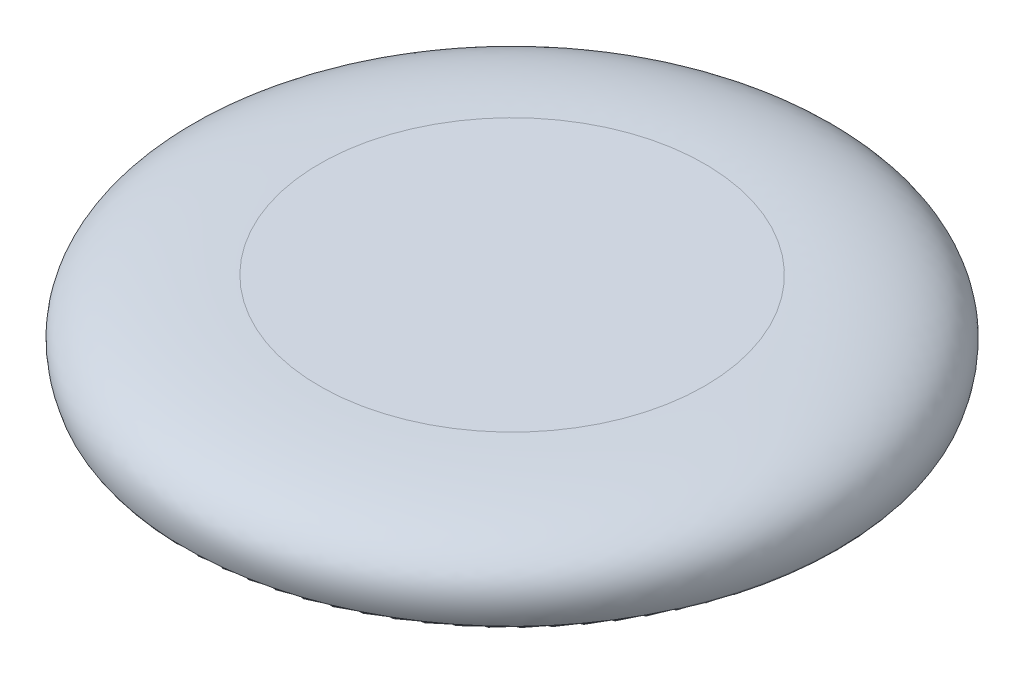
ISO-10303-21;
HEADER;
FILE_DESCRIPTION(('STEP AP214'),'2;1');
FILE_NAME('part.step','',(''),(''),'','','');
FILE_SCHEMA(('AUTOMOTIVE_DESIGN { 1 0 10303 214 1 1 1 1 }'));
ENDSEC;
DATA;
#1=APPLICATION_CONTEXT('core data for automotive mechanical design processes');
#2=APPLICATION_PROTOCOL_DEFINITION('international standard','automotive_design',2000,#1);
#3=PRODUCT_CONTEXT('',#1,'mechanical');
#4=PRODUCT('Part','Part','',(#3));
#5=PRODUCT_RELATED_PRODUCT_CATEGORY('part','',(#4));
#6=PRODUCT_DEFINITION_FORMATION('','',#4);
#7=PRODUCT_DEFINITION_CONTEXT('part definition',#1,'design');
#8=PRODUCT_DEFINITION('design','',#6,#7);
#9=PRODUCT_DEFINITION_SHAPE('','',#8);
#10=(LENGTH_UNIT() NAMED_UNIT(*) SI_UNIT(.MILLI.,.METRE.));
#11=(NAMED_UNIT(*) PLANE_ANGLE_UNIT() SI_UNIT($,.RADIAN.));
#12=(NAMED_UNIT(*) SI_UNIT($,.STERADIAN.) SOLID_ANGLE_UNIT());
#13=UNCERTAINTY_MEASURE_WITH_UNIT(LENGTH_MEASURE(1.E-05),#10,'distance_accuracy_value','');
#14=(GEOMETRIC_REPRESENTATION_CONTEXT(3) GLOBAL_UNCERTAINTY_ASSIGNED_CONTEXT((#13)) GLOBAL_UNIT_ASSIGNED_CONTEXT((#10,
#11,#12)) REPRESENTATION_CONTEXT('',''));
#15=CARTESIAN_POINT('',(0.,0.,0.));
#16=DIRECTION('',(0.,0.,1.));
#17=DIRECTION('',(1.,0.,0.));
#18=AXIS2_PLACEMENT_3D('',#15,#16,#17);
#19=CARTESIAN_POINT('',(0.,29.,0.));
#20=DIRECTION('',(0.,-1.,0.));
#21=DIRECTION('',(1.,0.,0.));
#22=AXIS2_PLACEMENT_3D('',#19,#20,#21);
#23=PLANE('',#22);
#24=CARTESIAN_POINT('',(0.,29.,0.));
#25=DIRECTION('',(0.,-1.,0.));
#26=DIRECTION('',(1.,0.,0.));
#27=AXIS2_PLACEMENT_3D('',#24,#25,#26);
#28=CIRCLE('',#27,80.);
#29=CARTESIAN_POINT('',(80.,29.,0.));
#30=VERTEX_POINT('',#29);
#31=EDGE_CURVE('E61',#30,#30,#28,.T.);
#32=ORIENTED_EDGE('',*,*,#31,.T.);
#33=EDGE_LOOP('',(#32));
#34=FACE_BOUND('',#33,.T.);
#35=ADVANCED_FACE('F41',(#34),#23,.T.);
#36=CARTESIAN_POINT('',(80.,29.,0.));
#37=CARTESIAN_POINT('',(80.689072442312,29.,0.));
#38=CARTESIAN_POINT('',(82.0768627169495,28.9948464655879,0.));
#39=CARTESIAN_POINT('',(84.775164613557,28.963951160128,0.));
#40=CARTESIAN_POINT('',(88.0563541162947,28.8867817295365,0.));
#41=CARTESIAN_POINT('',(91.8299515075125,28.7326969637539,0.));
#42=CARTESIAN_POINT('',(96.6482998290496,28.4456187662775,0.));
#43=CARTESIAN_POINT('',(102.267656423896,27.9344373639931,0.));
#44=CARTESIAN_POINT('',(108.361107153441,27.0808073894777,0.));
#45=CARTESIAN_POINT('',(113.798438754182,25.9923180921626,0.));
#46=CARTESIAN_POINT('',(120.163760178967,24.2404422517693,0.));
#47=CARTESIAN_POINT('',(126.444056898713,21.515342649294,0.));
#48=CARTESIAN_POINT('',(129.940253056564,18.6715989143196,0.));
#49=CARTESIAN_POINT('',(131.564316018938,16.6883060670833,0.));
#50=CARTESIAN_POINT('',(132.538964768356,15.2595978349276,0.));
#51=CARTESIAN_POINT('',(133.44086849453,13.2651534482053,0.));
#52=CARTESIAN_POINT('',(133.972265686486,10.640097783018,0.));
#53=CARTESIAN_POINT('',(133.976836941374,8.29410615751145,0.));
#54=CARTESIAN_POINT('',(133.7079010204,6.24297680164635,0.));
#55=CARTESIAN_POINT('',(133.364260873871,4.61759347200709,0.));
#56=CARTESIAN_POINT('',(132.954452213561,3.18817437948394,0.));
#57=CARTESIAN_POINT('',(132.553131280972,2.00704244183232,0.));
#58=CARTESIAN_POINT('',(132.323417751652,1.3930934696551,0.));
#59=CARTESIAN_POINT('',(132.205627951561,1.09155158142143,0.));
#60=B_SPLINE_CURVE_WITH_KNOTS('',3,(#36,#37,#38,#39,#40,#41,#42,#43,#44,#45,#46,#47,#48,#49,#50,
#51,#52,#53,#54,#55,#56,#57,#58,#59),.UNSPECIFIED.,.F.,.F.,(4,1,1,1,1,1,1,1,1,1,1,1,1,1,1,1,1,1,
1,1,1,4),(0.,0.015625,0.03125,0.0625,0.09375,0.125,0.1875,0.25,0.3125,0.375,0.5,0.625,
0.647010898071307,0.678260898071307,0.75,0.8125,0.875,0.90625,0.9375,0.96875,0.984375,1.),.UNSPECIFIED.);
#61=CARTESIAN_POINT('',(0.,0.,0.));
#62=DIRECTION('',(0.,-1.,0.));
#63=AXIS1_PLACEMENT('',#61,#62);
#64=SURFACE_OF_REVOLUTION('',#60,#63);
#65=CARTESIAN_POINT('',(0.,16.2567064395825,0.));
#66=DIRECTION('',(0.,-1.,0.));
#67=DIRECTION('',(1.,0.,0.));
#68=AXIS2_PLACEMENT_3D('',#65,#66,#67);
#69=CIRCLE('',#68,131.851977882948);
#70=CARTESIAN_POINT('',(131.851977882948,16.2567064395825,0.));
#71=VERTEX_POINT('',#70);
#72=EDGE_CURVE('E64',#71,#71,#69,.T.);
#73=ORIENTED_EDGE('',*,*,#72,.T.);
#74=EDGE_LOOP('',(#73));
#75=FACE_BOUND('',#74,.T.);
#76=ORIENTED_EDGE('',*,*,#31,.F.);
#77=EDGE_LOOP('',(#76));
#78=FACE_BOUND('',#77,.T.);
#79=ADVANCED_FACE('F92',(#75,#78),#64,.F.);
#80=CARTESIAN_POINT('',(0.,16.2567064395825,0.));
#81=DIRECTION('',(0.,1.,0.));
#82=DIRECTION('',(-1.,0.,0.));
#83=AXIS2_PLACEMENT_3D('',#80,#81,#82);
#84=CONICAL_SURFACE('',#83,131.851977882948,0.0523598775594309);
#85=CARTESIAN_POINT('',(0.,2.10467191248531,0.));
#86=DIRECTION('',(0.,-1.,0.));
#87=DIRECTION('',(1.,0.,0.));
#88=AXIS2_PLACEMENT_3D('',#85,#86,#87);
#89=CIRCLE('',#88,131.110301181052);
#90=CARTESIAN_POINT('',(131.110301181052,2.10467191248531,0.));
#91=VERTEX_POINT('',#90);
#92=EDGE_CURVE('E56',#91,#91,#89,.T.);
#93=ORIENTED_EDGE('',*,*,#92,.T.);
#94=EDGE_LOOP('',(#93));
#95=FACE_BOUND('',#94,.T.);
#96=ORIENTED_EDGE('',*,*,#72,.F.);
#97=EDGE_LOOP('',(#96));
#98=FACE_BOUND('',#97,.T.);
#99=ADVANCED_FACE('F89',(#95,#98),#84,.F.);
#100=CARTESIAN_POINT('',(131.,0.,0.));
#101=DIRECTION('',(0.,-1.,0.));
#102=DIRECTION('',(1.,0.,0.));
#103=AXIS2_PLACEMENT_3D('',#100,#101,#102);
#104=PLANE('',#103);
#105=CARTESIAN_POINT('',(0.,0.,0.));
#106=DIRECTION('',(0.,-1.,0.));
#107=DIRECTION('',(1.,0.,0.));
#108=AXIS2_PLACEMENT_3D('',#105,#106,#107);
#109=CIRCLE('',#108,133.107560250561);
#110=CARTESIAN_POINT('',(133.107560250561,0.,0.));
#111=VERTEX_POINT('',#110);
#112=EDGE_CURVE('E48',#111,#111,#109,.F.);
#113=ORIENTED_EDGE('',*,*,#112,.T.);
#114=EDGE_LOOP('',(#113));
#115=FACE_BOUND('',#114,.T.);
#116=CARTESIAN_POINT('',(0.,0.,0.));
#117=DIRECTION('',(0.,-1.,0.));
#118=DIRECTION('',(1.,0.,0.));
#119=AXIS2_PLACEMENT_3D('',#116,#117,#118);
#120=CIRCLE('',#119,133.605230175748);
#121=CARTESIAN_POINT('',(133.605230175748,0.,0.));
#122=VERTEX_POINT('',#121);
#123=EDGE_CURVE('E52',#122,#122,#120,.T.);
#124=ORIENTED_EDGE('',*,*,#123,.T.);
#125=EDGE_LOOP('',(#124));
#126=FACE_BOUND('',#125,.T.);
#127=ADVANCED_FACE('F86',(#115,#126),#104,.T.);
#128=CARTESIAN_POINT('',(135.,0.,0.));
#129=CARTESIAN_POINT('',(147.5,32.,0.));
#130=CARTESIAN_POINT('',(80.,32.,0.));
#131=(BOUNDED_CURVE() B_SPLINE_CURVE(2,(#128,#129,#130),.UNSPECIFIED.,.F.,
.F.) B_SPLINE_CURVE_WITH_KNOTS((3,3),(0.,1.),
.UNSPECIFIED.) CURVE() GEOMETRIC_REPRESENTATION_ITEM() RATIONAL_B_SPLINE_CURVE((1.,1.,1.)) REPRESENTATION_ITEM(''));
#132=CARTESIAN_POINT('',(0.,0.,0.));
#133=DIRECTION('',(0.,-1.,0.));
#134=AXIS1_PLACEMENT('',#132,#133);
#135=SURFACE_OF_REVOLUTION('',#131,#134);
#136=CARTESIAN_POINT('',(0.,1.34817455261361,0.));
#137=DIRECTION('',(0.,-1.,0.));
#138=DIRECTION('',(1.,0.,0.));
#139=AXIS2_PLACEMENT_3D('',#136,#137,#138);
#140=CIRCLE('',#139,135.496029897067);
#141=CARTESIAN_POINT('',(135.496029897067,1.34817455261361,0.));
#142=VERTEX_POINT('',#141);
#143=EDGE_CURVE('E10',#142,#142,#140,.F.);
#144=ORIENTED_EDGE('',*,*,#143,.T.);
#145=EDGE_LOOP('',(#144));
#146=FACE_BOUND('',#145,.T.);
#147=CARTESIAN_POINT('',(0.,32.,0.));
#148=DIRECTION('',(0.,-1.,0.));
#149=DIRECTION('',(1.,0.,0.));
#150=AXIS2_PLACEMENT_3D('',#147,#148,#149);
#151=CIRCLE('',#150,80.);
#152=CARTESIAN_POINT('',(80.,32.,0.));
#153=VERTEX_POINT('',#152);
#154=EDGE_CURVE('E67',#153,#153,#151,.T.);
#155=ORIENTED_EDGE('',*,*,#154,.T.);
#156=EDGE_LOOP('',(#155));
#157=FACE_BOUND('',#156,.T.);
#158=ADVANCED_FACE('F81',(#146,#157),#135,.F.);
#159=CARTESIAN_POINT('',(0.,32.,0.));
#160=DIRECTION('',(0.,1.,0.));
#161=DIRECTION('',(-1.,0.,0.));
#162=AXIS2_PLACEMENT_3D('',#159,#160,#161);
#163=PLANE('',#162);
#164=ORIENTED_EDGE('',*,*,#154,.F.);
#165=EDGE_LOOP('',(#164));
#166=FACE_BOUND('',#165,.T.);
#167=ADVANCED_FACE('F85',(#166),#163,.T.);
#168=CARTESIAN_POINT('',(0.,2.,0.));
#169=DIRECTION('',(0.,-1.,0.));
#170=DIRECTION('',(1.,0.,0.));
#171=AXIS2_PLACEMENT_3D('',#168,#169,#170);
#172=TOROIDAL_SURFACE('',#171,133.107560250561,2.);
#173=ORIENTED_EDGE('',*,*,#112,.F.);
#174=EDGE_LOOP('',(#173));
#175=FACE_BOUND('',#174,.T.);
#176=ORIENTED_EDGE('',*,*,#92,.F.);
#177=EDGE_LOOP('',(#176));
#178=FACE_BOUND('',#177,.T.);
#179=ADVANCED_FACE('F99',(#175,#178),#172,.T.);
#180=CARTESIAN_POINT('',(0.,2.,0.));
#181=DIRECTION('',(0.,-1.,0.));
#182=DIRECTION('',(1.,0.,0.));
#183=AXIS2_PLACEMENT_3D('',#180,#181,#182);
#184=TOROIDAL_SURFACE('',#183,133.605230175748,2.);
#185=ORIENTED_EDGE('',*,*,#143,.F.);
#186=EDGE_LOOP('',(#185));
#187=FACE_BOUND('',#186,.T.);
#188=ORIENTED_EDGE('',*,*,#123,.F.);
#189=EDGE_LOOP('',(#188));
#190=FACE_BOUND('',#189,.T.);
#191=ADVANCED_FACE('F43',(#187,#190),#184,.T.);
#192=CLOSED_SHELL('',(#35,#79,#99,#127,#158,#167,#179,#191));
#193=MANIFOLD_SOLID_BREP('B2',#192);
#194=ADVANCED_BREP_SHAPE_REPRESENTATION('',(#18,#193),#14);
#195=SHAPE_DEFINITION_REPRESENTATION(#9,#194);
ENDSEC;
END-ISO-10303-21;
